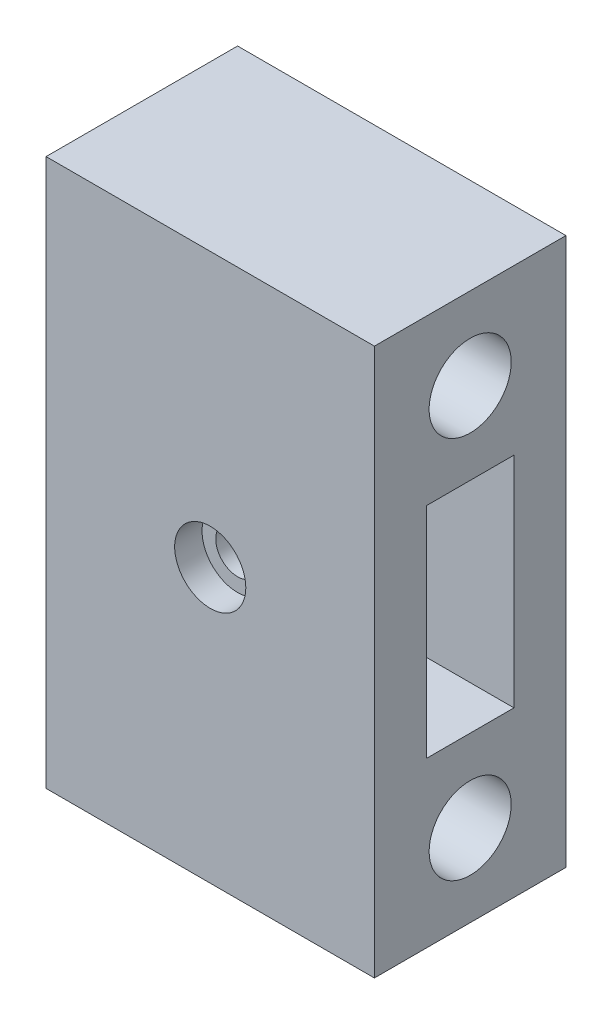
ISO-10303-21;
HEADER;
FILE_DESCRIPTION(('STEP AP214'),'2;1');
FILE_NAME('part.step','',(''),(''),'','','');
FILE_SCHEMA(('AUTOMOTIVE_DESIGN { 1 0 10303 214 1 1 1 1 }'));
ENDSEC;
DATA;
#1=APPLICATION_CONTEXT('core data for automotive mechanical design processes');
#2=APPLICATION_PROTOCOL_DEFINITION('international standard','automotive_design',2000,#1);
#3=PRODUCT_CONTEXT('',#1,'mechanical');
#4=PRODUCT('Part','Part','',(#3));
#5=PRODUCT_RELATED_PRODUCT_CATEGORY('part','',(#4));
#6=PRODUCT_DEFINITION_FORMATION('','',#4);
#7=PRODUCT_DEFINITION_CONTEXT('part definition',#1,'design');
#8=PRODUCT_DEFINITION('design','',#6,#7);
#9=PRODUCT_DEFINITION_SHAPE('','',#8);
#10=(LENGTH_UNIT() NAMED_UNIT(*) SI_UNIT(.MILLI.,.METRE.));
#11=(NAMED_UNIT(*) PLANE_ANGLE_UNIT() SI_UNIT($,.RADIAN.));
#12=(NAMED_UNIT(*) SI_UNIT($,.STERADIAN.) SOLID_ANGLE_UNIT());
#13=UNCERTAINTY_MEASURE_WITH_UNIT(LENGTH_MEASURE(1.E-05),#10,'distance_accuracy_value','');
#14=(GEOMETRIC_REPRESENTATION_CONTEXT(3) GLOBAL_UNCERTAINTY_ASSIGNED_CONTEXT((#13)) GLOBAL_UNIT_ASSIGNED_CONTEXT((#10,
#11,#12)) REPRESENTATION_CONTEXT('',''));
#15=CARTESIAN_POINT('',(0.,0.,0.));
#16=DIRECTION('',(0.,0.,1.));
#17=DIRECTION('',(1.,0.,0.));
#18=AXIS2_PLACEMENT_3D('',#15,#16,#17);
#19=CARTESIAN_POINT('',(0.,0.,35.));
#20=DIRECTION('',(0.,0.,-1.));
#21=DIRECTION('',(-1.,0.,0.));
#22=AXIS2_PLACEMENT_3D('',#19,#20,#21);
#23=CYLINDRICAL_SURFACE('',#22,4.);
#24=CARTESIAN_POINT('',(0.,0.,9.49999999999999));
#25=DIRECTION('',(0.,0.,-1.));
#26=DIRECTION('',(-1.,0.,0.));
#27=AXIS2_PLACEMENT_3D('',#24,#25,#26);
#28=CIRCLE('',#27,4.);
#29=CARTESIAN_POINT('',(-4.,0.,9.49999999999999));
#30=VERTEX_POINT('',#29);
#31=EDGE_CURVE('E200',#30,#30,#28,.T.);
#32=ORIENTED_EDGE('',*,*,#31,.F.);
#33=EDGE_LOOP('',(#32));
#34=FACE_BOUND('',#33,.T.);
#35=CARTESIAN_POINT('',(0.,0.,7.5));
#36=DIRECTION('',(0.,0.,-1.));
#37=DIRECTION('',(-1.,0.,0.));
#38=AXIS2_PLACEMENT_3D('',#35,#36,#37);
#39=CIRCLE('',#38,4.);
#40=CARTESIAN_POINT('',(-4.,0.,7.5));
#41=VERTEX_POINT('',#40);
#42=EDGE_CURVE('E39',#41,#41,#39,.F.);
#43=ORIENTED_EDGE('',*,*,#42,.F.);
#44=EDGE_LOOP('',(#43));
#45=FACE_BOUND('',#44,.T.);
#46=ADVANCED_FACE('F35',(#34,#45),#23,.F.);
#47=CARTESIAN_POINT('',(0.,0.,25.5));
#48=DIRECTION('',(0.,0.,1.));
#49=DIRECTION('',(1.,0.,0.));
#50=AXIS2_PLACEMENT_3D('',#47,#48,#49);
#51=CIRCLE('',#50,4.);
#52=CARTESIAN_POINT('',(4.,0.,25.5));
#53=VERTEX_POINT('',#52);
#54=EDGE_CURVE('E203',#53,#53,#51,.T.);
#55=ORIENTED_EDGE('',*,*,#54,.F.);
#56=EDGE_LOOP('',(#55));
#57=FACE_BOUND('',#56,.T.);
#58=CARTESIAN_POINT('',(0.,0.,30.));
#59=DIRECTION('',(0.,0.,1.));
#60=DIRECTION('',(1.,0.,0.));
#61=AXIS2_PLACEMENT_3D('',#58,#59,#60);
#62=CIRCLE('',#61,4.);
#63=CARTESIAN_POINT('',(4.,0.,30.));
#64=VERTEX_POINT('',#63);
#65=EDGE_CURVE('E196',#64,#64,#62,.F.);
#66=ORIENTED_EDGE('',*,*,#65,.F.);
#67=EDGE_LOOP('',(#66));
#68=FACE_BOUND('',#67,.T.);
#69=ADVANCED_FACE('F278',(#57,#68),#23,.F.);
#70=CARTESIAN_POINT('',(30.,-50.,35.));
#71=DIRECTION('',(-1.,0.,0.));
#72=DIRECTION('',(0.,0.,1.));
#73=AXIS2_PLACEMENT_3D('',#70,#71,#72);
#74=PLANE('',#73);
#75=CARTESIAN_POINT('',(30.,35.,17.5));
#76=DIRECTION('',(1.,0.,0.));
#77=DIRECTION('',(0.,0.,-1.));
#78=AXIS2_PLACEMENT_3D('',#75,#76,#77);
#79=CIRCLE('',#78,7.5);
#80=CARTESIAN_POINT('',(30.,35.,10.));
#81=VERTEX_POINT('',#80);
#82=EDGE_CURVE('E208',#81,#81,#79,.T.);
#83=ORIENTED_EDGE('',*,*,#82,.F.);
#84=EDGE_LOOP('',(#83));
#85=FACE_BOUND('',#84,.T.);
#86=CARTESIAN_POINT('',(30.,-35.,17.5));
#87=DIRECTION('',(1.,0.,0.));
#88=DIRECTION('',(0.,0.,1.));
#89=AXIS2_PLACEMENT_3D('',#86,#87,#88);
#90=CIRCLE('',#89,7.5);
#91=CARTESIAN_POINT('',(30.,-35.,25.));
#92=VERTEX_POINT('',#91);
#93=EDGE_CURVE('E214',#92,#92,#90,.T.);
#94=ORIENTED_EDGE('',*,*,#93,.F.);
#95=EDGE_LOOP('',(#94));
#96=FACE_BOUND('',#95,.T.);
#97=DIRECTION('',(0.,0.,1.));
#98=VECTOR('',#97,1.);
#99=CARTESIAN_POINT('',(30.,20.,25.5));
#100=LINE('',#99,#98);
#101=CARTESIAN_POINT('',(30.,20.,9.49999999999999));
#102=VERTEX_POINT('',#101);
#103=CARTESIAN_POINT('',(30.,20.,25.5));
#104=VERTEX_POINT('',#103);
#105=EDGE_CURVE('E233',#102,#104,#100,.T.);
#106=ORIENTED_EDGE('',*,*,#105,.F.);
#107=DIRECTION('',(0.,1.,0.));
#108=VECTOR('',#107,1.);
#109=CARTESIAN_POINT('',(30.,-20.,9.49999999999999));
#110=LINE('',#109,#108);
#111=CARTESIAN_POINT('',(30.,-20.,9.49999999999999));
#112=VERTEX_POINT('',#111);
#113=EDGE_CURVE('E60',#112,#102,#110,.T.);
#114=ORIENTED_EDGE('',*,*,#113,.F.);
#115=DIRECTION('',(0.,0.,-1.));
#116=VECTOR('',#115,1.);
#117=CARTESIAN_POINT('',(30.,-20.,25.5));
#118=LINE('',#117,#116);
#119=CARTESIAN_POINT('',(30.,-20.,25.5));
#120=VERTEX_POINT('',#119);
#121=EDGE_CURVE('E222',#120,#112,#118,.T.);
#122=ORIENTED_EDGE('',*,*,#121,.F.);
#123=DIRECTION('',(0.,-1.,0.));
#124=VECTOR('',#123,1.);
#125=CARTESIAN_POINT('',(30.,-20.,25.5));
#126=LINE('',#125,#124);
#127=EDGE_CURVE('E236',#104,#120,#126,.T.);
#128=ORIENTED_EDGE('',*,*,#127,.F.);
#129=EDGE_LOOP('',(#106,#114,#122,#128));
#130=FACE_BOUND('',#129,.T.);
#131=DIRECTION('',(0.,1.,0.));
#132=VECTOR('',#131,1.);
#133=CARTESIAN_POINT('',(30.,-50.,0.));
#134=LINE('',#133,#132);
#135=CARTESIAN_POINT('',(30.,-50.,0.));
#136=VERTEX_POINT('',#135);
#137=CARTESIAN_POINT('',(30.,50.,0.));
#138=VERTEX_POINT('',#137);
#139=EDGE_CURVE('E207',#136,#138,#134,.T.);
#140=ORIENTED_EDGE('',*,*,#139,.T.);
#141=DIRECTION('',(0.,0.,-1.));
#142=VECTOR('',#141,1.);
#143=CARTESIAN_POINT('',(30.,50.,35.));
#144=LINE('',#143,#142);
#145=CARTESIAN_POINT('',(30.,50.,35.));
#146=VERTEX_POINT('',#145);
#147=EDGE_CURVE('E11',#146,#138,#144,.T.);
#148=ORIENTED_EDGE('',*,*,#147,.F.);
#149=DIRECTION('',(0.,1.,0.));
#150=VECTOR('',#149,1.);
#151=CARTESIAN_POINT('',(30.,-50.,35.));
#152=LINE('',#151,#150);
#153=CARTESIAN_POINT('',(30.,-50.,35.));
#154=VERTEX_POINT('',#153);
#155=EDGE_CURVE('E247',#154,#146,#152,.T.);
#156=ORIENTED_EDGE('',*,*,#155,.F.);
#157=DIRECTION('',(0.,0.,-1.));
#158=VECTOR('',#157,1.);
#159=CARTESIAN_POINT('',(30.,-50.,35.));
#160=LINE('',#159,#158);
#161=EDGE_CURVE('E257',#154,#136,#160,.T.);
#162=ORIENTED_EDGE('',*,*,#161,.T.);
#163=EDGE_LOOP('',(#140,#148,#156,#162));
#164=FACE_BOUND('',#163,.T.);
#165=ADVANCED_FACE('F37',(#85,#96,#130,#164),#74,.F.);
#166=CARTESIAN_POINT('',(-30.,50.,35.));
#167=DIRECTION('',(0.,-1.,0.));
#168=DIRECTION('',(0.,0.,-1.));
#169=AXIS2_PLACEMENT_3D('',#166,#167,#168);
#170=PLANE('',#169);
#171=DIRECTION('',(-1.,0.,0.));
#172=VECTOR('',#171,1.);
#173=CARTESIAN_POINT('',(-30.,50.,0.));
#174=LINE('',#173,#172);
#175=CARTESIAN_POINT('',(-30.,50.,0.));
#176=VERTEX_POINT('',#175);
#177=EDGE_CURVE('E260',#138,#176,#174,.T.);
#178=ORIENTED_EDGE('',*,*,#177,.T.);
#179=DIRECTION('',(0.,0.,-1.));
#180=VECTOR('',#179,1.);
#181=CARTESIAN_POINT('',(-30.,50.,35.));
#182=LINE('',#181,#180);
#183=CARTESIAN_POINT('',(-30.,50.,35.));
#184=VERTEX_POINT('',#183);
#185=EDGE_CURVE('E44',#184,#176,#182,.T.);
#186=ORIENTED_EDGE('',*,*,#185,.F.);
#187=DIRECTION('',(-1.,0.,0.));
#188=VECTOR('',#187,1.);
#189=CARTESIAN_POINT('',(-30.,50.,35.));
#190=LINE('',#189,#188);
#191=EDGE_CURVE('E250',#146,#184,#190,.T.);
#192=ORIENTED_EDGE('',*,*,#191,.F.);
#193=ORIENTED_EDGE('',*,*,#147,.T.);
#194=EDGE_LOOP('',(#178,#186,#192,#193));
#195=FACE_BOUND('',#194,.T.);
#196=ADVANCED_FACE('F286',(#195),#170,.F.);
#197=CARTESIAN_POINT('',(-30.,-50.,35.));
#198=DIRECTION('',(1.,0.,0.));
#199=DIRECTION('',(0.,0.,-1.));
#200=AXIS2_PLACEMENT_3D('',#197,#198,#199);
#201=PLANE('',#200);
#202=DIRECTION('',(0.,-1.,0.));
#203=VECTOR('',#202,1.);
#204=CARTESIAN_POINT('',(-30.,-50.,0.));
#205=LINE('',#204,#203);
#206=CARTESIAN_POINT('',(-30.,-50.,0.));
#207=VERTEX_POINT('',#206);
#208=EDGE_CURVE('E262',#176,#207,#205,.T.);
#209=ORIENTED_EDGE('',*,*,#208,.T.);
#210=DIRECTION('',(0.,0.,-1.));
#211=VECTOR('',#210,1.);
#212=CARTESIAN_POINT('',(-30.,-50.,35.));
#213=LINE('',#212,#211);
#214=CARTESIAN_POINT('',(-30.,-50.,35.));
#215=VERTEX_POINT('',#214);
#216=EDGE_CURVE('E267',#215,#207,#213,.T.);
#217=ORIENTED_EDGE('',*,*,#216,.F.);
#218=DIRECTION('',(0.,-1.,0.));
#219=VECTOR('',#218,1.);
#220=CARTESIAN_POINT('',(-30.,-50.,35.));
#221=LINE('',#220,#219);
#222=EDGE_CURVE('E253',#184,#215,#221,.T.);
#223=ORIENTED_EDGE('',*,*,#222,.F.);
#224=ORIENTED_EDGE('',*,*,#185,.T.);
#225=EDGE_LOOP('',(#209,#217,#223,#224));
#226=FACE_BOUND('',#225,.T.);
#227=ADVANCED_FACE('F341',(#226),#201,.F.);
#228=CARTESIAN_POINT('',(-30.,-50.,35.));
#229=DIRECTION('',(0.,1.,0.));
#230=DIRECTION('',(0.,0.,1.));
#231=AXIS2_PLACEMENT_3D('',#228,#229,#230);
#232=PLANE('',#231);
#233=DIRECTION('',(1.,0.,0.));
#234=VECTOR('',#233,1.);
#235=CARTESIAN_POINT('',(-30.,-50.,0.));
#236=LINE('',#235,#234);
#237=EDGE_CURVE('E251',#207,#136,#236,.T.);
#238=ORIENTED_EDGE('',*,*,#237,.T.);
#239=ORIENTED_EDGE('',*,*,#161,.F.);
#240=DIRECTION('',(1.,0.,0.));
#241=VECTOR('',#240,1.);
#242=CARTESIAN_POINT('',(-30.,-50.,35.));
#243=LINE('',#242,#241);
#244=EDGE_CURVE('E255',#215,#154,#243,.T.);
#245=ORIENTED_EDGE('',*,*,#244,.F.);
#246=ORIENTED_EDGE('',*,*,#216,.T.);
#247=EDGE_LOOP('',(#238,#239,#245,#246));
#248=FACE_BOUND('',#247,.T.);
#249=ADVANCED_FACE('F334',(#248),#232,.F.);
#250=CARTESIAN_POINT('',(0.,0.,35.));
#251=DIRECTION('',(0.,0.,-1.));
#252=DIRECTION('',(-1.,0.,0.));
#253=AXIS2_PLACEMENT_3D('',#250,#251,#252);
#254=PLANE('',#253);
#255=CARTESIAN_POINT('',(0.,0.,35.));
#256=DIRECTION('',(0.,0.,1.));
#257=DIRECTION('',(1.,0.,0.));
#258=AXIS2_PLACEMENT_3D('',#255,#256,#257);
#259=CIRCLE('',#258,6.5);
#260=CARTESIAN_POINT('',(6.5,0.,35.));
#261=VERTEX_POINT('',#260);
#262=EDGE_CURVE('E197',#261,#261,#259,.T.);
#263=ORIENTED_EDGE('',*,*,#262,.F.);
#264=EDGE_LOOP('',(#263));
#265=FACE_BOUND('',#264,.T.);
#266=ORIENTED_EDGE('',*,*,#155,.T.);
#267=ORIENTED_EDGE('',*,*,#191,.T.);
#268=ORIENTED_EDGE('',*,*,#222,.T.);
#269=ORIENTED_EDGE('',*,*,#244,.T.);
#270=EDGE_LOOP('',(#266,#267,#268,#269));
#271=FACE_BOUND('',#270,.T.);
#272=ADVANCED_FACE('F331',(#265,#271),#254,.F.);
#273=CARTESIAN_POINT('',(0.,0.,0.));
#274=DIRECTION('',(0.,0.,-1.));
#275=DIRECTION('',(-1.,0.,0.));
#276=AXIS2_PLACEMENT_3D('',#273,#274,#275);
#277=PLANE('',#276);
#278=DIRECTION('',(0.,1.,0.));
#279=VECTOR('',#278,1.);
#280=CARTESIAN_POINT('',(-7.5055,-4.33330244540274,0.));
#281=LINE('',#280,#279);
#282=CARTESIAN_POINT('',(-7.5055,-4.33330244540274,0.));
#283=VERTEX_POINT('',#282);
#284=CARTESIAN_POINT('',(-7.5055,4.33330244540274,0.));
#285=VERTEX_POINT('',#284);
#286=EDGE_CURVE('E52',#283,#285,#281,.T.);
#287=ORIENTED_EDGE('',*,*,#286,.F.);
#288=DIRECTION('',(-0.866025403784438,0.5,0.));
#289=VECTOR('',#288,1.);
#290=CARTESIAN_POINT('',(0.,-8.66660489080548,0.));
#291=LINE('',#290,#289);
#292=CARTESIAN_POINT('',(0.,-8.66660489080548,0.));
#293=VERTEX_POINT('',#292);
#294=EDGE_CURVE('E160',#293,#283,#291,.T.);
#295=ORIENTED_EDGE('',*,*,#294,.F.);
#296=DIRECTION('',(-0.866025403784439,-0.5,0.));
#297=VECTOR('',#296,1.);
#298=CARTESIAN_POINT('',(7.5055,-4.33330244540274,0.));
#299=LINE('',#298,#297);
#300=CARTESIAN_POINT('',(7.5055,-4.33330244540274,0.));
#301=VERTEX_POINT('',#300);
#302=EDGE_CURVE('E163',#301,#293,#299,.T.);
#303=ORIENTED_EDGE('',*,*,#302,.F.);
#304=DIRECTION('',(0.,-1.,0.));
#305=VECTOR('',#304,1.);
#306=CARTESIAN_POINT('',(7.5055,4.33330244540274,0.));
#307=LINE('',#306,#305);
#308=CARTESIAN_POINT('',(7.5055,4.33330244540274,0.));
#309=VERTEX_POINT('',#308);
#310=EDGE_CURVE('E179',#309,#301,#307,.T.);
#311=ORIENTED_EDGE('',*,*,#310,.F.);
#312=DIRECTION('',(0.866025403784439,-0.5,0.));
#313=VECTOR('',#312,1.);
#314=CARTESIAN_POINT('',(0.,8.66660489080548,0.));
#315=LINE('',#314,#313);
#316=CARTESIAN_POINT('',(0.,8.66660489080548,0.));
#317=VERTEX_POINT('',#316);
#318=EDGE_CURVE('E176',#317,#309,#315,.T.);
#319=ORIENTED_EDGE('',*,*,#318,.F.);
#320=DIRECTION('',(0.866025403784438,0.5,0.));
#321=VECTOR('',#320,1.);
#322=CARTESIAN_POINT('',(-7.5055,4.33330244540274,0.));
#323=LINE('',#322,#321);
#324=EDGE_CURVE('E174',#285,#317,#323,.T.);
#325=ORIENTED_EDGE('',*,*,#324,.F.);
#326=EDGE_LOOP('',(#287,#295,#303,#311,#319,#325));
#327=FACE_BOUND('',#326,.T.);
#328=ORIENTED_EDGE('',*,*,#139,.F.);
#329=ORIENTED_EDGE('',*,*,#237,.F.);
#330=ORIENTED_EDGE('',*,*,#208,.F.);
#331=ORIENTED_EDGE('',*,*,#177,.F.);
#332=EDGE_LOOP('',(#328,#329,#330,#331));
#333=FACE_BOUND('',#332,.T.);
#334=ADVANCED_FACE('F329',(#327,#333),#277,.T.);
#335=CARTESIAN_POINT('',(-25.,-20.,9.49999999999999));
#336=DIRECTION('',(0.,0.,-1.));
#337=DIRECTION('',(-1.,0.,0.));
#338=AXIS2_PLACEMENT_3D('',#335,#336,#337);
#339=PLANE('',#338);
#340=ORIENTED_EDGE('',*,*,#31,.T.);
#341=EDGE_LOOP('',(#340));
#342=FACE_BOUND('',#341,.T.);
#343=ORIENTED_EDGE('',*,*,#113,.T.);
#344=DIRECTION('',(1.,0.,0.));
#345=VECTOR('',#344,1.);
#346=CARTESIAN_POINT('',(-25.,20.,9.49999999999999));
#347=LINE('',#346,#345);
#348=CARTESIAN_POINT('',(-25.,20.,9.49999999999999));
#349=VERTEX_POINT('',#348);
#350=EDGE_CURVE('E231',#349,#102,#347,.T.);
#351=ORIENTED_EDGE('',*,*,#350,.F.);
#352=DIRECTION('',(0.,1.,0.));
#353=VECTOR('',#352,1.);
#354=CARTESIAN_POINT('',(-25.,-20.,9.49999999999999));
#355=LINE('',#354,#353);
#356=CARTESIAN_POINT('',(-25.,-20.,9.49999999999999));
#357=VERTEX_POINT('',#356);
#358=EDGE_CURVE('E218',#357,#349,#355,.T.);
#359=ORIENTED_EDGE('',*,*,#358,.F.);
#360=DIRECTION('',(1.,0.,0.));
#361=VECTOR('',#360,1.);
#362=CARTESIAN_POINT('',(-25.,-20.,9.49999999999999));
#363=LINE('',#362,#361);
#364=EDGE_CURVE('E217',#357,#112,#363,.T.);
#365=ORIENTED_EDGE('',*,*,#364,.T.);
#366=EDGE_LOOP('',(#343,#351,#359,#365));
#367=FACE_BOUND('',#366,.T.);
#368=ADVANCED_FACE('F319',(#342,#367),#339,.F.);
#369=CARTESIAN_POINT('',(-25.,-20.,25.5));
#370=DIRECTION('',(0.,-1.,0.));
#371=DIRECTION('',(0.,0.,-1.));
#372=AXIS2_PLACEMENT_3D('',#369,#370,#371);
#373=PLANE('',#372);
#374=ORIENTED_EDGE('',*,*,#121,.T.);
#375=ORIENTED_EDGE('',*,*,#364,.F.);
#376=DIRECTION('',(0.,0.,-1.));
#377=VECTOR('',#376,1.);
#378=CARTESIAN_POINT('',(-25.,-20.,25.5));
#379=LINE('',#378,#377);
#380=CARTESIAN_POINT('',(-25.,-20.,25.5));
#381=VERTEX_POINT('',#380);
#382=EDGE_CURVE('E228',#381,#357,#379,.T.);
#383=ORIENTED_EDGE('',*,*,#382,.F.);
#384=DIRECTION('',(1.,0.,0.));
#385=VECTOR('',#384,1.);
#386=CARTESIAN_POINT('',(-25.,-20.,25.5));
#387=LINE('',#386,#385);
#388=EDGE_CURVE('E242',#381,#120,#387,.T.);
#389=ORIENTED_EDGE('',*,*,#388,.T.);
#390=EDGE_LOOP('',(#374,#375,#383,#389));
#391=FACE_BOUND('',#390,.T.);
#392=ADVANCED_FACE('F315',(#391),#373,.F.);
#393=CARTESIAN_POINT('',(-25.,-20.,25.5));
#394=DIRECTION('',(0.,0.,1.));
#395=DIRECTION('',(1.,0.,0.));
#396=AXIS2_PLACEMENT_3D('',#393,#394,#395);
#397=PLANE('',#396);
#398=ORIENTED_EDGE('',*,*,#54,.T.);
#399=EDGE_LOOP('',(#398));
#400=FACE_BOUND('',#399,.T.);
#401=ORIENTED_EDGE('',*,*,#127,.T.);
#402=ORIENTED_EDGE('',*,*,#388,.F.);
#403=DIRECTION('',(0.,-1.,0.));
#404=VECTOR('',#403,1.);
#405=CARTESIAN_POINT('',(-25.,-20.,25.5));
#406=LINE('',#405,#404);
#407=CARTESIAN_POINT('',(-25.,20.,25.5));
#408=VERTEX_POINT('',#407);
#409=EDGE_CURVE('E225',#408,#381,#406,.T.);
#410=ORIENTED_EDGE('',*,*,#409,.F.);
#411=DIRECTION('',(1.,0.,0.));
#412=VECTOR('',#411,1.);
#413=CARTESIAN_POINT('',(-25.,20.,25.5));
#414=LINE('',#413,#412);
#415=EDGE_CURVE('E244',#408,#104,#414,.T.);
#416=ORIENTED_EDGE('',*,*,#415,.T.);
#417=EDGE_LOOP('',(#401,#402,#410,#416));
#418=FACE_BOUND('',#417,.T.);
#419=ADVANCED_FACE('F318',(#400,#418),#397,.F.);
#420=CARTESIAN_POINT('',(-25.,20.,25.5));
#421=DIRECTION('',(0.,1.,0.));
#422=DIRECTION('',(0.,0.,1.));
#423=AXIS2_PLACEMENT_3D('',#420,#421,#422);
#424=PLANE('',#423);
#425=ORIENTED_EDGE('',*,*,#105,.T.);
#426=ORIENTED_EDGE('',*,*,#415,.F.);
#427=DIRECTION('',(0.,0.,1.));
#428=VECTOR('',#427,1.);
#429=CARTESIAN_POINT('',(-25.,20.,25.5));
#430=LINE('',#429,#428);
#431=EDGE_CURVE('E221',#349,#408,#430,.T.);
#432=ORIENTED_EDGE('',*,*,#431,.F.);
#433=ORIENTED_EDGE('',*,*,#350,.T.);
#434=EDGE_LOOP('',(#425,#426,#432,#433));
#435=FACE_BOUND('',#434,.T.);
#436=ADVANCED_FACE('F313',(#435),#424,.F.);
#437=CARTESIAN_POINT('',(-25.,0.,0.));
#438=DIRECTION('',(-1.,0.,0.));
#439=DIRECTION('',(0.,0.,1.));
#440=AXIS2_PLACEMENT_3D('',#437,#438,#439);
#441=PLANE('',#440);
#442=ORIENTED_EDGE('',*,*,#358,.T.);
#443=ORIENTED_EDGE('',*,*,#431,.T.);
#444=ORIENTED_EDGE('',*,*,#409,.T.);
#445=ORIENTED_EDGE('',*,*,#382,.T.);
#446=EDGE_LOOP('',(#442,#443,#444,#445));
#447=FACE_BOUND('',#446,.T.);
#448=ADVANCED_FACE('F309',(#447),#441,.F.);
#449=CARTESIAN_POINT('',(-25.,-35.,17.5));
#450=DIRECTION('',(1.,0.,0.));
#451=DIRECTION('',(0.,0.,-1.));
#452=AXIS2_PLACEMENT_3D('',#449,#450,#451);
#453=CYLINDRICAL_SURFACE('',#452,7.5);
#454=CARTESIAN_POINT('',(-25.,-35.,17.5));
#455=DIRECTION('',(1.,0.,0.));
#456=DIRECTION('',(0.,0.,1.));
#457=AXIS2_PLACEMENT_3D('',#454,#455,#456);
#458=CIRCLE('',#457,7.5);
#459=CARTESIAN_POINT('',(-25.,-35.,25.));
#460=VERTEX_POINT('',#459);
#461=EDGE_CURVE('E211',#460,#460,#458,.T.);
#462=ORIENTED_EDGE('',*,*,#461,.F.);
#463=EDGE_LOOP('',(#462));
#464=FACE_BOUND('',#463,.T.);
#465=ORIENTED_EDGE('',*,*,#93,.T.);
#466=EDGE_LOOP('',(#465));
#467=FACE_BOUND('',#466,.T.);
#468=ADVANCED_FACE('F305',(#464,#467),#453,.F.);
#469=CARTESIAN_POINT('',(-25.,-35.,17.5));
#470=DIRECTION('',(-1.,0.,0.));
#471=DIRECTION('',(0.,0.,1.));
#472=AXIS2_PLACEMENT_3D('',#469,#470,#471);
#473=PLANE('',#472);
#474=ORIENTED_EDGE('',*,*,#461,.T.);
#475=EDGE_LOOP('',(#474));
#476=FACE_BOUND('',#475,.T.);
#477=ADVANCED_FACE('F301',(#476),#473,.F.);
#478=CARTESIAN_POINT('',(-25.,35.,17.5));
#479=DIRECTION('',(1.,0.,0.));
#480=DIRECTION('',(0.,0.,-1.));
#481=AXIS2_PLACEMENT_3D('',#478,#479,#480);
#482=CYLINDRICAL_SURFACE('',#481,7.5);
#483=CARTESIAN_POINT('',(-25.,35.,17.5));
#484=DIRECTION('',(1.,0.,0.));
#485=DIRECTION('',(0.,0.,-1.));
#486=AXIS2_PLACEMENT_3D('',#483,#484,#485);
#487=CIRCLE('',#486,7.5);
#488=CARTESIAN_POINT('',(-25.,35.,10.));
#489=VERTEX_POINT('',#488);
#490=EDGE_CURVE('E204',#489,#489,#487,.T.);
#491=ORIENTED_EDGE('',*,*,#490,.F.);
#492=EDGE_LOOP('',(#491));
#493=FACE_BOUND('',#492,.T.);
#494=ORIENTED_EDGE('',*,*,#82,.T.);
#495=EDGE_LOOP('',(#494));
#496=FACE_BOUND('',#495,.T.);
#497=ADVANCED_FACE('F297',(#493,#496),#482,.F.);
#498=CARTESIAN_POINT('',(-25.,35.,17.5));
#499=DIRECTION('',(1.,0.,0.));
#500=DIRECTION('',(0.,0.,-1.));
#501=AXIS2_PLACEMENT_3D('',#498,#499,#500);
#502=PLANE('',#501);
#503=ORIENTED_EDGE('',*,*,#490,.T.);
#504=EDGE_LOOP('',(#503));
#505=FACE_BOUND('',#504,.T.);
#506=ADVANCED_FACE('F294',(#505),#502,.T.);
#507=CARTESIAN_POINT('',(0.,0.,30.));
#508=DIRECTION('',(0.,0.,1.));
#509=DIRECTION('',(1.,0.,0.));
#510=AXIS2_PLACEMENT_3D('',#507,#508,#509);
#511=PLANE('',#510);
#512=CARTESIAN_POINT('',(0.,0.,30.));
#513=DIRECTION('',(0.,0.,1.));
#514=DIRECTION('',(1.,0.,0.));
#515=AXIS2_PLACEMENT_3D('',#512,#513,#514);
#516=CIRCLE('',#515,6.5);
#517=CARTESIAN_POINT('',(6.5,0.,30.));
#518=VERTEX_POINT('',#517);
#519=EDGE_CURVE('E193',#518,#518,#516,.T.);
#520=ORIENTED_EDGE('',*,*,#519,.T.);
#521=EDGE_LOOP('',(#520));
#522=FACE_BOUND('',#521,.T.);
#523=ORIENTED_EDGE('',*,*,#65,.T.);
#524=EDGE_LOOP('',(#523));
#525=FACE_BOUND('',#524,.T.);
#526=ADVANCED_FACE('F276',(#522,#525),#511,.T.);
#527=CARTESIAN_POINT('',(0.,0.,30.));
#528=DIRECTION('',(0.,0.,1.));
#529=DIRECTION('',(1.,0.,0.));
#530=AXIS2_PLACEMENT_3D('',#527,#528,#529);
#531=CYLINDRICAL_SURFACE('',#530,6.5);
#532=ORIENTED_EDGE('',*,*,#519,.F.);
#533=EDGE_LOOP('',(#532));
#534=FACE_BOUND('',#533,.T.);
#535=ORIENTED_EDGE('',*,*,#262,.T.);
#536=EDGE_LOOP('',(#535));
#537=FACE_BOUND('',#536,.T.);
#538=ADVANCED_FACE('F292',(#534,#537),#531,.F.);
#539=CARTESIAN_POINT('',(0.,0.,7.5));
#540=DIRECTION('',(0.,0.,-1.));
#541=DIRECTION('',(-1.,0.,0.));
#542=AXIS2_PLACEMENT_3D('',#539,#540,#541);
#543=PLANE('',#542);
#544=DIRECTION('',(0.,1.,0.));
#545=VECTOR('',#544,1.);
#546=CARTESIAN_POINT('',(-7.5055,-4.33330244540274,7.5));
#547=LINE('',#546,#545);
#548=CARTESIAN_POINT('',(-7.5055,-4.33330244540274,7.5));
#549=VERTEX_POINT('',#548);
#550=CARTESIAN_POINT('',(-7.5055,4.33330244540274,7.5));
#551=VERTEX_POINT('',#550);
#552=EDGE_CURVE('E140',#549,#551,#547,.T.);
#553=ORIENTED_EDGE('',*,*,#552,.T.);
#554=DIRECTION('',(0.866025403784438,0.5,0.));
#555=VECTOR('',#554,1.);
#556=CARTESIAN_POINT('',(-7.5055,4.33330244540274,7.5));
#557=LINE('',#556,#555);
#558=CARTESIAN_POINT('',(0.,8.66660489080548,7.5));
#559=VERTEX_POINT('',#558);
#560=EDGE_CURVE('E149',#551,#559,#557,.T.);
#561=ORIENTED_EDGE('',*,*,#560,.T.);
#562=DIRECTION('',(0.866025403784439,-0.5,0.));
#563=VECTOR('',#562,1.);
#564=CARTESIAN_POINT('',(0.,8.66660489080548,7.5));
#565=LINE('',#564,#563);
#566=CARTESIAN_POINT('',(7.5055,4.33330244540274,7.5));
#567=VERTEX_POINT('',#566);
#568=EDGE_CURVE('E154',#559,#567,#565,.T.);
#569=ORIENTED_EDGE('',*,*,#568,.T.);
#570=DIRECTION('',(0.,-1.,0.));
#571=VECTOR('',#570,1.);
#572=CARTESIAN_POINT('',(7.5055,4.33330244540274,7.5));
#573=LINE('',#572,#571);
#574=CARTESIAN_POINT('',(7.5055,-4.33330244540274,7.5));
#575=VERTEX_POINT('',#574);
#576=EDGE_CURVE('E167',#567,#575,#573,.T.);
#577=ORIENTED_EDGE('',*,*,#576,.T.);
#578=DIRECTION('',(-0.866025403784439,-0.5,0.));
#579=VECTOR('',#578,1.);
#580=CARTESIAN_POINT('',(7.5055,-4.33330244540274,7.5));
#581=LINE('',#580,#579);
#582=CARTESIAN_POINT('',(0.,-8.66660489080548,7.5));
#583=VERTEX_POINT('',#582);
#584=EDGE_CURVE('E170',#575,#583,#581,.T.);
#585=ORIENTED_EDGE('',*,*,#584,.T.);
#586=DIRECTION('',(-0.866025403784438,0.5,0.));
#587=VECTOR('',#586,1.);
#588=CARTESIAN_POINT('',(0.,-8.66660489080548,7.5));
#589=LINE('',#588,#587);
#590=EDGE_CURVE('E146',#583,#549,#589,.T.);
#591=ORIENTED_EDGE('',*,*,#590,.T.);
#592=EDGE_LOOP('',(#553,#561,#569,#577,#585,#591));
#593=FACE_BOUND('',#592,.T.);
#594=ORIENTED_EDGE('',*,*,#42,.T.);
#595=EDGE_LOOP('',(#594));
#596=FACE_BOUND('',#595,.T.);
#597=ADVANCED_FACE('F156',(#593,#596),#543,.T.);
#598=CARTESIAN_POINT('',(-7.5055,-4.33330244540274,7.5));
#599=DIRECTION('',(-1.,0.,0.));
#600=DIRECTION('',(0.,-1.,0.));
#601=AXIS2_PLACEMENT_3D('',#598,#599,#600);
#602=PLANE('',#601);
#603=ORIENTED_EDGE('',*,*,#286,.T.);
#604=DIRECTION('',(0.,0.,-1.));
#605=VECTOR('',#604,1.);
#606=CARTESIAN_POINT('',(-7.5055,4.33330244540274,7.5));
#607=LINE('',#606,#605);
#608=EDGE_CURVE('E136',#551,#285,#607,.T.);
#609=ORIENTED_EDGE('',*,*,#608,.F.);
#610=ORIENTED_EDGE('',*,*,#552,.F.);
#611=DIRECTION('',(0.,0.,-1.));
#612=VECTOR('',#611,1.);
#613=CARTESIAN_POINT('',(-7.5055,-4.33330244540274,7.5));
#614=LINE('',#613,#612);
#615=EDGE_CURVE('E184',#549,#283,#614,.T.);
#616=ORIENTED_EDGE('',*,*,#615,.T.);
#617=EDGE_LOOP('',(#603,#609,#610,#616));
#618=FACE_BOUND('',#617,.T.);
#619=ADVANCED_FACE('F138',(#618),#602,.F.);
#620=CARTESIAN_POINT('',(0.,-8.66660489080548,7.5));
#621=DIRECTION('',(-0.5,-0.866025403784438,0.));
#622=DIRECTION('',(0.866025403784439,-0.5,0.));
#623=AXIS2_PLACEMENT_3D('',#620,#621,#622);
#624=PLANE('',#623);
#625=ORIENTED_EDGE('',*,*,#294,.T.);
#626=ORIENTED_EDGE('',*,*,#615,.F.);
#627=ORIENTED_EDGE('',*,*,#590,.F.);
#628=DIRECTION('',(0.,0.,-1.));
#629=VECTOR('',#628,1.);
#630=CARTESIAN_POINT('',(0.,-8.66660489080548,7.5));
#631=LINE('',#630,#629);
#632=EDGE_CURVE('E186',#583,#293,#631,.T.);
#633=ORIENTED_EDGE('',*,*,#632,.T.);
#634=EDGE_LOOP('',(#625,#626,#627,#633));
#635=FACE_BOUND('',#634,.T.);
#636=ADVANCED_FACE('F441',(#635),#624,.F.);
#637=CARTESIAN_POINT('',(7.5055,-4.33330244540274,7.5));
#638=DIRECTION('',(0.5,-0.866025403784439,0.));
#639=DIRECTION('',(0.866025403784439,0.5,0.));
#640=AXIS2_PLACEMENT_3D('',#637,#638,#639);
#641=PLANE('',#640);
#642=ORIENTED_EDGE('',*,*,#302,.T.);
#643=ORIENTED_EDGE('',*,*,#632,.F.);
#644=ORIENTED_EDGE('',*,*,#584,.F.);
#645=DIRECTION('',(0.,0.,-1.));
#646=VECTOR('',#645,1.);
#647=CARTESIAN_POINT('',(7.5055,-4.33330244540274,7.5));
#648=LINE('',#647,#646);
#649=EDGE_CURVE('E188',#575,#301,#648,.T.);
#650=ORIENTED_EDGE('',*,*,#649,.T.);
#651=EDGE_LOOP('',(#642,#643,#644,#650));
#652=FACE_BOUND('',#651,.T.);
#653=ADVANCED_FACE('F448',(#652),#641,.F.);
#654=CARTESIAN_POINT('',(7.5055,4.33330244540274,7.5));
#655=DIRECTION('',(1.,0.,0.));
#656=DIRECTION('',(0.,1.,0.));
#657=AXIS2_PLACEMENT_3D('',#654,#655,#656);
#658=PLANE('',#657);
#659=ORIENTED_EDGE('',*,*,#310,.T.);
#660=ORIENTED_EDGE('',*,*,#649,.F.);
#661=ORIENTED_EDGE('',*,*,#576,.F.);
#662=DIRECTION('',(0.,0.,-1.));
#663=VECTOR('',#662,1.);
#664=CARTESIAN_POINT('',(7.5055,4.33330244540274,7.5));
#665=LINE('',#664,#663);
#666=EDGE_CURVE('E190',#567,#309,#665,.T.);
#667=ORIENTED_EDGE('',*,*,#666,.T.);
#668=EDGE_LOOP('',(#659,#660,#661,#667));
#669=FACE_BOUND('',#668,.T.);
#670=ADVANCED_FACE('F456',(#669),#658,.F.);
#671=CARTESIAN_POINT('',(0.,8.66660489080548,7.5));
#672=DIRECTION('',(0.5,0.866025403784439,0.));
#673=DIRECTION('',(-0.866025403784439,0.5,0.));
#674=AXIS2_PLACEMENT_3D('',#671,#672,#673);
#675=PLANE('',#674);
#676=ORIENTED_EDGE('',*,*,#318,.T.);
#677=ORIENTED_EDGE('',*,*,#666,.F.);
#678=ORIENTED_EDGE('',*,*,#568,.F.);
#679=DIRECTION('',(0.,0.,-1.));
#680=VECTOR('',#679,1.);
#681=CARTESIAN_POINT('',(0.,8.66660489080548,7.5));
#682=LINE('',#681,#680);
#683=EDGE_CURVE('E145',#559,#317,#682,.T.);
#684=ORIENTED_EDGE('',*,*,#683,.T.);
#685=EDGE_LOOP('',(#676,#677,#678,#684));
#686=FACE_BOUND('',#685,.T.);
#687=ADVANCED_FACE('F464',(#686),#675,.F.);
#688=CARTESIAN_POINT('',(-7.5055,4.33330244540274,7.5));
#689=DIRECTION('',(-0.5,0.866025403784438,0.));
#690=DIRECTION('',(-0.866025403784439,-0.5,0.));
#691=AXIS2_PLACEMENT_3D('',#688,#689,#690);
#692=PLANE('',#691);
#693=ORIENTED_EDGE('',*,*,#324,.T.);
#694=ORIENTED_EDGE('',*,*,#683,.F.);
#695=ORIENTED_EDGE('',*,*,#560,.F.);
#696=ORIENTED_EDGE('',*,*,#608,.T.);
#697=EDGE_LOOP('',(#693,#694,#695,#696));
#698=FACE_BOUND('',#697,.T.);
#699=ADVANCED_FACE('F150',(#698),#692,.F.);
#700=CLOSED_SHELL('',(#46,#69,#165,#196,#227,#249,#272,#334,#368,#392,#419,#436,#448,#468,#477,
#497,#506,#526,#538,#597,#619,#636,#653,#670,#687,#699));
#701=MANIFOLD_SOLID_BREP('B2',#700);
#702=ADVANCED_BREP_SHAPE_REPRESENTATION('',(#18,#701),#14);
#703=SHAPE_DEFINITION_REPRESENTATION(#9,#702);
ENDSEC;
END-ISO-10303-21;
